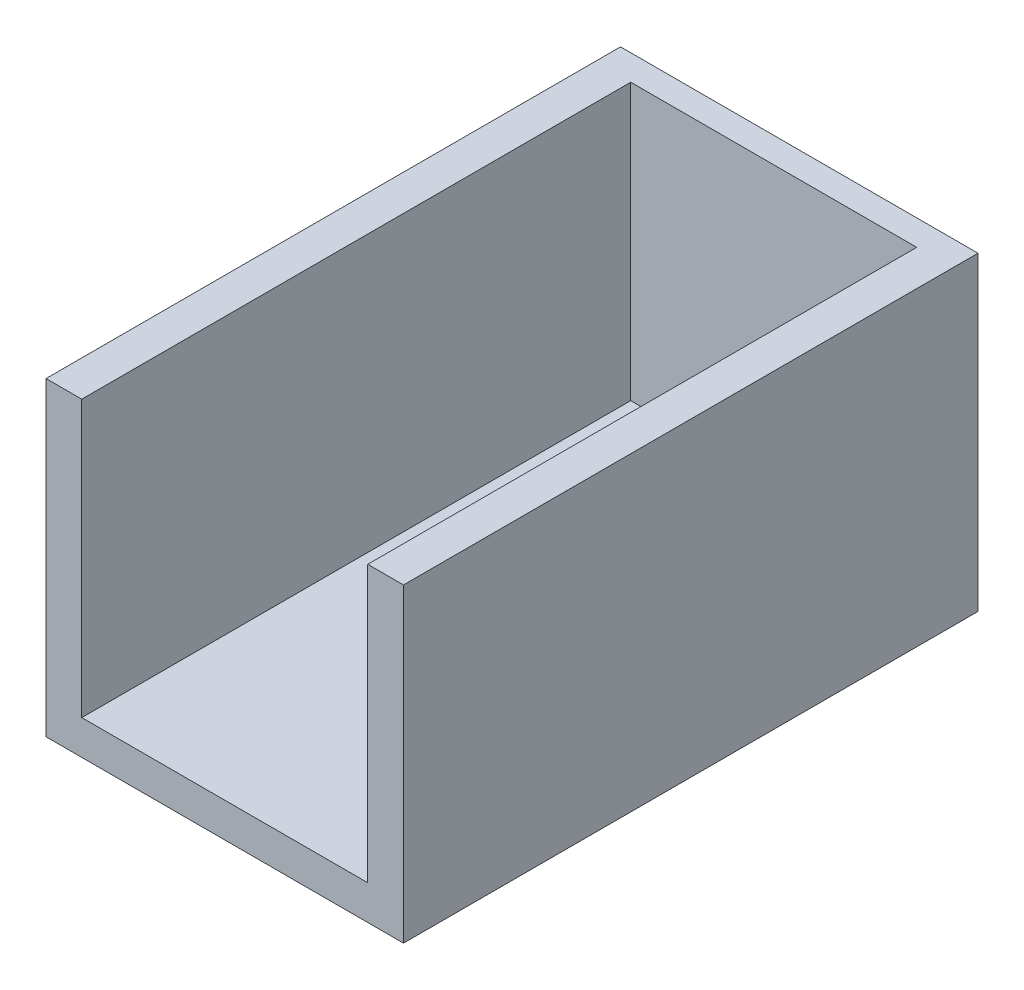
ISO-10303-21;
HEADER;
FILE_DESCRIPTION(('STEP AP214'),'2;1');
FILE_NAME('part.step','',(''),(''),'','','');
FILE_SCHEMA(('AUTOMOTIVE_DESIGN { 1 0 10303 214 1 1 1 1 }'));
ENDSEC;
DATA;
#1=APPLICATION_CONTEXT('core data for automotive mechanical design processes');
#2=APPLICATION_PROTOCOL_DEFINITION('international standard','automotive_design',2000,#1);
#3=PRODUCT_CONTEXT('',#1,'mechanical');
#4=PRODUCT('Part','Part','',(#3));
#5=PRODUCT_RELATED_PRODUCT_CATEGORY('part','',(#4));
#6=PRODUCT_DEFINITION_FORMATION('','',#4);
#7=PRODUCT_DEFINITION_CONTEXT('part definition',#1,'design');
#8=PRODUCT_DEFINITION('design','',#6,#7);
#9=PRODUCT_DEFINITION_SHAPE('','',#8);
#10=(LENGTH_UNIT() NAMED_UNIT(*) SI_UNIT(.MILLI.,.METRE.));
#11=(NAMED_UNIT(*) PLANE_ANGLE_UNIT() SI_UNIT($,.RADIAN.));
#12=(NAMED_UNIT(*) SI_UNIT($,.STERADIAN.) SOLID_ANGLE_UNIT());
#13=UNCERTAINTY_MEASURE_WITH_UNIT(LENGTH_MEASURE(1.E-05),#10,'distance_accuracy_value','');
#14=(GEOMETRIC_REPRESENTATION_CONTEXT(3) GLOBAL_UNCERTAINTY_ASSIGNED_CONTEXT((#13)) GLOBAL_UNIT_ASSIGNED_CONTEXT((#10,
#11,#12)) REPRESENTATION_CONTEXT('',''));
#15=CARTESIAN_POINT('',(0.,0.,0.));
#16=DIRECTION('',(0.,0.,1.));
#17=DIRECTION('',(1.,0.,0.));
#18=AXIS2_PLACEMENT_3D('',#15,#16,#17);
#19=CARTESIAN_POINT('',(14.,-13.5,45.));
#20=DIRECTION('',(-1.,0.,0.));
#21=DIRECTION('',(0.,0.,1.));
#22=AXIS2_PLACEMENT_3D('',#19,#20,#21);
#23=PLANE('',#22);
#24=DIRECTION('',(0.,1.,0.));
#25=VECTOR('',#24,1.);
#26=CARTESIAN_POINT('',(14.,-13.5,0.));
#27=LINE('',#26,#25);
#28=CARTESIAN_POINT('',(14.,-13.5,0.));
#29=VERTEX_POINT('',#28);
#30=CARTESIAN_POINT('',(14.,10.8,0.));
#31=VERTEX_POINT('',#30);
#32=EDGE_CURVE('E144',#29,#31,#27,.T.);
#33=ORIENTED_EDGE('',*,*,#32,.T.);
#34=DIRECTION('',(0.,0.,1.));
#35=VECTOR('',#34,1.);
#36=CARTESIAN_POINT('',(14.,10.8,0.));
#37=LINE('',#36,#35);
#38=CARTESIAN_POINT('',(14.,10.8,45.));
#39=VERTEX_POINT('',#38);
#40=EDGE_CURVE('E128',#31,#39,#37,.T.);
#41=ORIENTED_EDGE('',*,*,#40,.T.);
#42=DIRECTION('',(0.,1.,0.));
#43=VECTOR('',#42,1.);
#44=CARTESIAN_POINT('',(14.,-13.5,45.));
#45=LINE('',#44,#43);
#46=CARTESIAN_POINT('',(14.,-13.5,45.));
#47=VERTEX_POINT('',#46);
#48=EDGE_CURVE('E148',#47,#39,#45,.T.);
#49=ORIENTED_EDGE('',*,*,#48,.F.);
#50=DIRECTION('',(0.,0.,-1.));
#51=VECTOR('',#50,1.);
#52=CARTESIAN_POINT('',(14.,-13.5,45.));
#53=LINE('',#52,#51);
#54=EDGE_CURVE('E56',#47,#29,#53,.T.);
#55=ORIENTED_EDGE('',*,*,#54,.T.);
#56=EDGE_LOOP('',(#33,#41,#49,#55));
#57=FACE_BOUND('',#56,.T.);
#58=ADVANCED_FACE('F47',(#57),#23,.F.);
#59=CARTESIAN_POINT('',(-14.,-13.5,45.));
#60=DIRECTION('',(1.,0.,0.));
#61=DIRECTION('',(0.,0.,-1.));
#62=AXIS2_PLACEMENT_3D('',#59,#60,#61);
#63=PLANE('',#62);
#64=DIRECTION('',(0.,-1.,0.));
#65=VECTOR('',#64,1.);
#66=CARTESIAN_POINT('',(-14.,-13.5,45.));
#67=LINE('',#66,#65);
#68=CARTESIAN_POINT('',(-14.,10.8,45.));
#69=VERTEX_POINT('',#68);
#70=CARTESIAN_POINT('',(-14.,-13.5,45.));
#71=VERTEX_POINT('',#70);
#72=EDGE_CURVE('E137',#69,#71,#67,.T.);
#73=ORIENTED_EDGE('',*,*,#72,.F.);
#74=DIRECTION('',(0.,0.,1.));
#75=VECTOR('',#74,1.);
#76=CARTESIAN_POINT('',(-14.,10.8,0.));
#77=LINE('',#76,#75);
#78=CARTESIAN_POINT('',(-14.,10.8,0.));
#79=VERTEX_POINT('',#78);
#80=EDGE_CURVE('E125',#79,#69,#77,.T.);
#81=ORIENTED_EDGE('',*,*,#80,.F.);
#82=DIRECTION('',(0.,-1.,0.));
#83=VECTOR('',#82,1.);
#84=CARTESIAN_POINT('',(-14.,-13.5,0.));
#85=LINE('',#84,#83);
#86=CARTESIAN_POINT('',(-14.,-13.5,0.));
#87=VERTEX_POINT('',#86);
#88=EDGE_CURVE('E75',#79,#87,#85,.T.);
#89=ORIENTED_EDGE('',*,*,#88,.T.);
#90=DIRECTION('',(0.,0.,-1.));
#91=VECTOR('',#90,1.);
#92=CARTESIAN_POINT('',(-14.,-13.5,45.));
#93=LINE('',#92,#91);
#94=EDGE_CURVE('E11',#71,#87,#93,.T.);
#95=ORIENTED_EDGE('',*,*,#94,.F.);
#96=EDGE_LOOP('',(#73,#81,#89,#95));
#97=FACE_BOUND('',#96,.T.);
#98=ADVANCED_FACE('F136',(#97),#63,.F.);
#99=CARTESIAN_POINT('',(-14.,-13.5,45.));
#100=DIRECTION('',(0.,1.,0.));
#101=DIRECTION('',(0.,0.,1.));
#102=AXIS2_PLACEMENT_3D('',#99,#100,#101);
#103=PLANE('',#102);
#104=DIRECTION('',(1.,0.,0.));
#105=VECTOR('',#104,1.);
#106=CARTESIAN_POINT('',(-14.,-13.5,0.));
#107=LINE('',#106,#105);
#108=EDGE_CURVE('E142',#87,#29,#107,.T.);
#109=ORIENTED_EDGE('',*,*,#108,.T.);
#110=ORIENTED_EDGE('',*,*,#54,.F.);
#111=DIRECTION('',(1.,0.,0.));
#112=VECTOR('',#111,1.);
#113=CARTESIAN_POINT('',(-14.,-13.5,45.));
#114=LINE('',#113,#112);
#115=EDGE_CURVE('E64',#71,#47,#114,.T.);
#116=ORIENTED_EDGE('',*,*,#115,.F.);
#117=ORIENTED_EDGE('',*,*,#94,.T.);
#118=EDGE_LOOP('',(#109,#110,#116,#117));
#119=FACE_BOUND('',#118,.T.);
#120=ADVANCED_FACE('F208',(#119),#103,.F.);
#121=CARTESIAN_POINT('',(0.,0.,45.));
#122=DIRECTION('',(0.,0.,-1.));
#123=DIRECTION('',(-1.,0.,0.));
#124=AXIS2_PLACEMENT_3D('',#121,#122,#123);
#125=PLANE('',#124);
#126=ORIENTED_EDGE('',*,*,#48,.T.);
#127=DIRECTION('',(1.,0.,0.));
#128=VECTOR('',#127,1.);
#129=CARTESIAN_POINT('',(-14.,10.8,45.));
#130=LINE('',#129,#128);
#131=CARTESIAN_POINT('',(11.2,10.8,45.));
#132=VERTEX_POINT('',#131);
#133=EDGE_CURVE('E201',#132,#39,#130,.T.);
#134=ORIENTED_EDGE('',*,*,#133,.F.);
#135=DIRECTION('',(0.,1.,0.));
#136=VECTOR('',#135,1.);
#137=CARTESIAN_POINT('',(11.2,-10.8,45.));
#138=LINE('',#137,#136);
#139=CARTESIAN_POINT('',(11.2,-10.8,45.));
#140=VERTEX_POINT('',#139);
#141=EDGE_CURVE('E181',#140,#132,#138,.T.);
#142=ORIENTED_EDGE('',*,*,#141,.F.);
#143=DIRECTION('',(1.,0.,0.));
#144=VECTOR('',#143,1.);
#145=CARTESIAN_POINT('',(-11.2,-10.8,45.));
#146=LINE('',#145,#144);
#147=CARTESIAN_POINT('',(-11.2,-10.8,45.));
#148=VERTEX_POINT('',#147);
#149=EDGE_CURVE('E173',#148,#140,#146,.T.);
#150=ORIENTED_EDGE('',*,*,#149,.F.);
#151=DIRECTION('',(0.,-1.,0.));
#152=VECTOR('',#151,1.);
#153=CARTESIAN_POINT('',(-11.2,-10.8,45.));
#154=LINE('',#153,#152);
#155=CARTESIAN_POINT('',(-11.2,10.8,45.));
#156=VERTEX_POINT('',#155);
#157=EDGE_CURVE('E177',#156,#148,#154,.T.);
#158=ORIENTED_EDGE('',*,*,#157,.F.);
#159=EDGE_CURVE('E133',#69,#156,#130,.T.);
#160=ORIENTED_EDGE('',*,*,#159,.F.);
#161=ORIENTED_EDGE('',*,*,#72,.T.);
#162=ORIENTED_EDGE('',*,*,#115,.T.);
#163=EDGE_LOOP('',(#126,#134,#142,#150,#158,#160,#161,#162));
#164=FACE_BOUND('',#163,.T.);
#165=ADVANCED_FACE('F206',(#164),#125,.F.);
#166=CARTESIAN_POINT('',(0.,0.,0.));
#167=DIRECTION('',(0.,0.,-1.));
#168=DIRECTION('',(-1.,0.,0.));
#169=AXIS2_PLACEMENT_3D('',#166,#167,#168);
#170=PLANE('',#169);
#171=DIRECTION('',(1.,0.,0.));
#172=VECTOR('',#171,1.);
#173=CARTESIAN_POINT('',(-14.,10.8,0.));
#174=LINE('',#173,#172);
#175=EDGE_CURVE('E123',#79,#31,#174,.T.);
#176=ORIENTED_EDGE('',*,*,#175,.T.);
#177=ORIENTED_EDGE('',*,*,#32,.F.);
#178=ORIENTED_EDGE('',*,*,#108,.F.);
#179=ORIENTED_EDGE('',*,*,#88,.F.);
#180=EDGE_LOOP('',(#176,#177,#178,#179));
#181=FACE_BOUND('',#180,.T.);
#182=ADVANCED_FACE('F141',(#181),#170,.T.);
#183=CARTESIAN_POINT('',(11.2,-10.8,2.));
#184=DIRECTION('',(1.,0.,0.));
#185=DIRECTION('',(0.,0.,-1.));
#186=AXIS2_PLACEMENT_3D('',#183,#184,#185);
#187=PLANE('',#186);
#188=ORIENTED_EDGE('',*,*,#141,.T.);
#189=DIRECTION('',(0.,0.,1.));
#190=VECTOR('',#189,1.);
#191=CARTESIAN_POINT('',(11.2,10.8,2.));
#192=LINE('',#191,#190);
#193=CARTESIAN_POINT('',(11.2,10.8,2.));
#194=VERTEX_POINT('',#193);
#195=EDGE_CURVE('E162',#194,#132,#192,.T.);
#196=ORIENTED_EDGE('',*,*,#195,.F.);
#197=DIRECTION('',(0.,1.,0.));
#198=VECTOR('',#197,1.);
#199=CARTESIAN_POINT('',(11.2,-10.8,2.));
#200=LINE('',#199,#198);
#201=CARTESIAN_POINT('',(11.2,-10.8,2.));
#202=VERTEX_POINT('',#201);
#203=EDGE_CURVE('E176',#202,#194,#200,.T.);
#204=ORIENTED_EDGE('',*,*,#203,.F.);
#205=DIRECTION('',(0.,0.,1.));
#206=VECTOR('',#205,1.);
#207=CARTESIAN_POINT('',(11.2,-10.8,2.));
#208=LINE('',#207,#206);
#209=EDGE_CURVE('E84',#202,#140,#208,.T.);
#210=ORIENTED_EDGE('',*,*,#209,.T.);
#211=EDGE_LOOP('',(#188,#196,#204,#210));
#212=FACE_BOUND('',#211,.T.);
#213=ADVANCED_FACE('F214',(#212),#187,.F.);
#214=CARTESIAN_POINT('',(-11.2,-10.8,2.));
#215=DIRECTION('',(0.,-1.,0.));
#216=DIRECTION('',(0.,0.,-1.));
#217=AXIS2_PLACEMENT_3D('',#214,#215,#216);
#218=PLANE('',#217);
#219=ORIENTED_EDGE('',*,*,#149,.T.);
#220=ORIENTED_EDGE('',*,*,#209,.F.);
#221=DIRECTION('',(1.,0.,0.));
#222=VECTOR('',#221,1.);
#223=CARTESIAN_POINT('',(-11.2,-10.8,2.));
#224=LINE('',#223,#222);
#225=CARTESIAN_POINT('',(-11.2,-10.8,2.));
#226=VERTEX_POINT('',#225);
#227=EDGE_CURVE('E165',#226,#202,#224,.T.);
#228=ORIENTED_EDGE('',*,*,#227,.F.);
#229=DIRECTION('',(0.,0.,1.));
#230=VECTOR('',#229,1.);
#231=CARTESIAN_POINT('',(-11.2,-10.8,2.));
#232=LINE('',#231,#230);
#233=EDGE_CURVE('E168',#226,#148,#232,.T.);
#234=ORIENTED_EDGE('',*,*,#233,.T.);
#235=EDGE_LOOP('',(#219,#220,#228,#234));
#236=FACE_BOUND('',#235,.T.);
#237=ADVANCED_FACE('F255',(#236),#218,.F.);
#238=CARTESIAN_POINT('',(-11.2,-10.8,2.));
#239=DIRECTION('',(-1.,0.,0.));
#240=DIRECTION('',(0.,0.,1.));
#241=AXIS2_PLACEMENT_3D('',#238,#239,#240);
#242=PLANE('',#241);
#243=ORIENTED_EDGE('',*,*,#157,.T.);
#244=ORIENTED_EDGE('',*,*,#233,.F.);
#245=DIRECTION('',(0.,-1.,0.));
#246=VECTOR('',#245,1.);
#247=CARTESIAN_POINT('',(-11.2,-10.8,2.));
#248=LINE('',#247,#246);
#249=CARTESIAN_POINT('',(-11.2,10.8,2.));
#250=VERTEX_POINT('',#249);
#251=EDGE_CURVE('E187',#250,#226,#248,.T.);
#252=ORIENTED_EDGE('',*,*,#251,.F.);
#253=DIRECTION('',(0.,0.,1.));
#254=VECTOR('',#253,1.);
#255=CARTESIAN_POINT('',(-11.2,10.8,2.));
#256=LINE('',#255,#254);
#257=EDGE_CURVE('E102',#250,#156,#256,.T.);
#258=ORIENTED_EDGE('',*,*,#257,.T.);
#259=EDGE_LOOP('',(#243,#244,#252,#258));
#260=FACE_BOUND('',#259,.T.);
#261=ADVANCED_FACE('F263',(#260),#242,.F.);
#262=CARTESIAN_POINT('',(0.,0.,2.));
#263=DIRECTION('',(0.,0.,-1.));
#264=DIRECTION('',(-1.,0.,0.));
#265=AXIS2_PLACEMENT_3D('',#262,#263,#264);
#266=PLANE('',#265);
#267=ORIENTED_EDGE('',*,*,#203,.T.);
#268=DIRECTION('',(-1.,0.,0.));
#269=VECTOR('',#268,1.);
#270=CARTESIAN_POINT('',(-11.2,10.8,2.));
#271=LINE('',#270,#269);
#272=EDGE_CURVE('E191',#194,#250,#271,.T.);
#273=ORIENTED_EDGE('',*,*,#272,.T.);
#274=ORIENTED_EDGE('',*,*,#251,.T.);
#275=ORIENTED_EDGE('',*,*,#227,.T.);
#276=EDGE_LOOP('',(#267,#273,#274,#275));
#277=FACE_BOUND('',#276,.T.);
#278=ADVANCED_FACE('F271',(#277),#266,.F.);
#279=CARTESIAN_POINT('',(-14.,10.8,0.));
#280=DIRECTION('',(0.,-1.,0.));
#281=DIRECTION('',(1.,0.,0.));
#282=AXIS2_PLACEMENT_3D('',#279,#280,#281);
#283=PLANE('',#282);
#284=ORIENTED_EDGE('',*,*,#133,.T.);
#285=ORIENTED_EDGE('',*,*,#40,.F.);
#286=ORIENTED_EDGE('',*,*,#175,.F.);
#287=ORIENTED_EDGE('',*,*,#80,.T.);
#288=ORIENTED_EDGE('',*,*,#159,.T.);
#289=ORIENTED_EDGE('',*,*,#257,.F.);
#290=ORIENTED_EDGE('',*,*,#272,.F.);
#291=ORIENTED_EDGE('',*,*,#195,.T.);
#292=EDGE_LOOP('',(#284,#285,#286,#287,#288,#289,#290,#291));
#293=FACE_BOUND('',#292,.T.);
#294=ADVANCED_FACE('F124',(#293),#283,.F.);
#295=CLOSED_SHELL('',(#58,#98,#120,#165,#182,#213,#237,#261,#278,#294));
#296=MANIFOLD_SOLID_BREP('B2',#295);
#297=ADVANCED_BREP_SHAPE_REPRESENTATION('',(#18,#296),#14);
#298=SHAPE_DEFINITION_REPRESENTATION(#9,#297);
ENDSEC;
END-ISO-10303-21;
